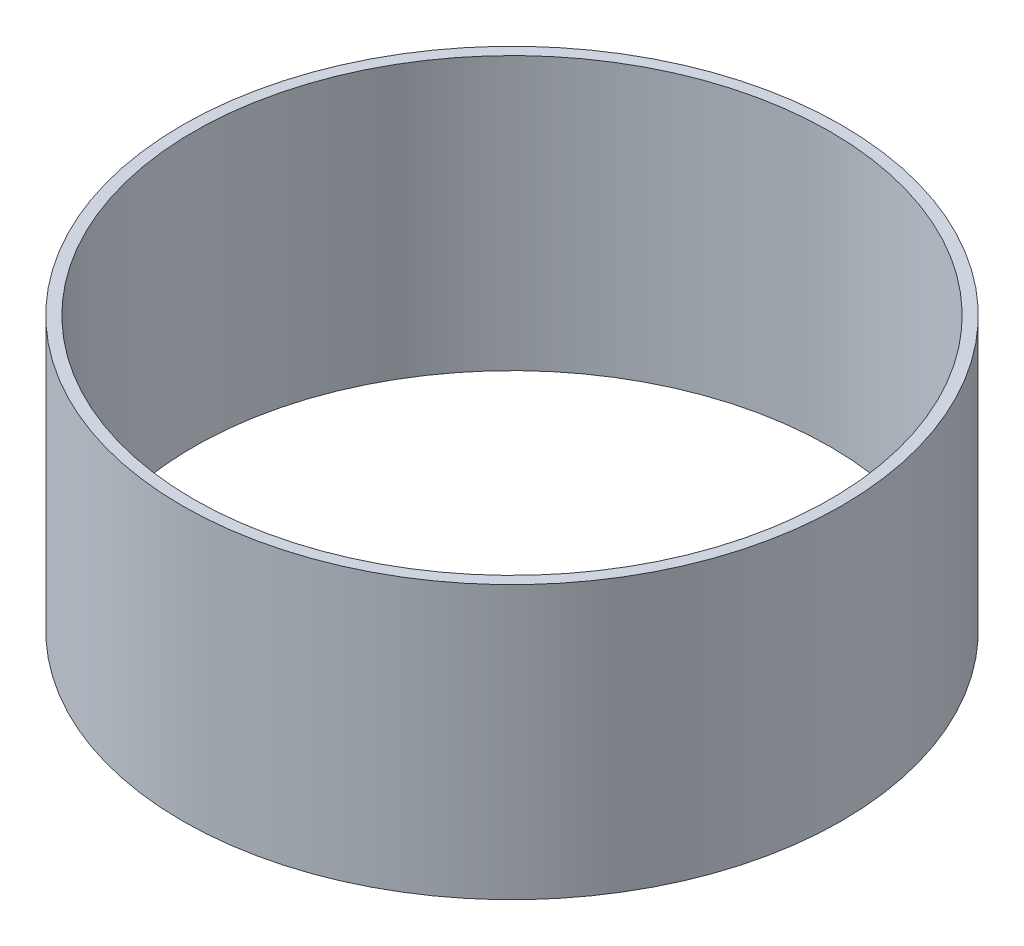
ISO-10303-21;
HEADER;
FILE_DESCRIPTION(('STEP AP214'),'2;1');
FILE_NAME('part.step','',(''),(''),'','','');
FILE_SCHEMA(('AUTOMOTIVE_DESIGN { 1 0 10303 214 1 1 1 1 }'));
ENDSEC;
DATA;
#1=APPLICATION_CONTEXT('core data for automotive mechanical design processes');
#2=APPLICATION_PROTOCOL_DEFINITION('international standard','automotive_design',2000,#1);
#3=PRODUCT_CONTEXT('',#1,'mechanical');
#4=PRODUCT('Part','Part','',(#3));
#5=PRODUCT_RELATED_PRODUCT_CATEGORY('part','',(#4));
#6=PRODUCT_DEFINITION_FORMATION('','',#4);
#7=PRODUCT_DEFINITION_CONTEXT('part definition',#1,'design');
#8=PRODUCT_DEFINITION('design','',#6,#7);
#9=PRODUCT_DEFINITION_SHAPE('','',#8);
#10=(LENGTH_UNIT() NAMED_UNIT(*) SI_UNIT(.MILLI.,.METRE.));
#11=(NAMED_UNIT(*) PLANE_ANGLE_UNIT() SI_UNIT($,.RADIAN.));
#12=(NAMED_UNIT(*) SI_UNIT($,.STERADIAN.) SOLID_ANGLE_UNIT());
#13=UNCERTAINTY_MEASURE_WITH_UNIT(LENGTH_MEASURE(1.E-05),#10,'distance_accuracy_value','');
#14=(GEOMETRIC_REPRESENTATION_CONTEXT(3) GLOBAL_UNCERTAINTY_ASSIGNED_CONTEXT((#13)) GLOBAL_UNIT_ASSIGNED_CONTEXT((#10,
#11,#12)) REPRESENTATION_CONTEXT('',''));
#15=CARTESIAN_POINT('',(0.,0.,0.));
#16=DIRECTION('',(0.,0.,1.));
#17=DIRECTION('',(1.,0.,0.));
#18=AXIS2_PLACEMENT_3D('',#15,#16,#17);
#19=CARTESIAN_POINT('',(0.,38.1,0.));
#20=DIRECTION('',(0.,1.,0.));
#21=DIRECTION('',(0.,0.,1.));
#22=AXIS2_PLACEMENT_3D('',#19,#20,#21);
#23=PLANE('',#22);
#24=CARTESIAN_POINT('',(0.,38.1,0.));
#25=DIRECTION('',(0.,1.,0.));
#26=DIRECTION('',(0.,0.,1.));
#27=AXIS2_PLACEMENT_3D('',#24,#25,#26);
#28=CIRCLE('',#27,92.075);
#29=CARTESIAN_POINT('',(0.,38.1,-92.075));
#30=VERTEX_POINT('',#29);
#31=EDGE_CURVE('E10',#30,#30,#28,.T.);
#32=ORIENTED_EDGE('',*,*,#31,.T.);
#33=EDGE_LOOP('',(#32));
#34=FACE_BOUND('',#33,.T.);
#35=CARTESIAN_POINT('',(0.,38.1,0.));
#36=DIRECTION('',(0.,1.,0.));
#37=DIRECTION('',(0.,0.,1.));
#38=AXIS2_PLACEMENT_3D('',#35,#36,#37);
#39=CIRCLE('',#38,88.9);
#40=CARTESIAN_POINT('',(0.,38.1,-88.9));
#41=VERTEX_POINT('',#40);
#42=EDGE_CURVE('E54',#41,#41,#39,.T.);
#43=ORIENTED_EDGE('',*,*,#42,.F.);
#44=EDGE_LOOP('',(#43));
#45=FACE_BOUND('',#44,.T.);
#46=ADVANCED_FACE('F43',(#34,#45),#23,.T.);
#47=CARTESIAN_POINT('',(0.,-38.1,0.));
#48=DIRECTION('',(0.,1.,0.));
#49=DIRECTION('',(0.,0.,1.));
#50=AXIS2_PLACEMENT_3D('',#47,#48,#49);
#51=PLANE('',#50);
#52=CARTESIAN_POINT('',(0.,-38.1,0.));
#53=DIRECTION('',(0.,1.,0.));
#54=DIRECTION('',(0.,0.,1.));
#55=AXIS2_PLACEMENT_3D('',#52,#53,#54);
#56=CIRCLE('',#55,92.075);
#57=CARTESIAN_POINT('',(0.,-38.1,-92.075));
#58=VERTEX_POINT('',#57);
#59=EDGE_CURVE('E47',#58,#58,#56,.T.);
#60=ORIENTED_EDGE('',*,*,#59,.F.);
#61=EDGE_LOOP('',(#60));
#62=FACE_BOUND('',#61,.T.);
#63=CARTESIAN_POINT('',(0.,-38.1,0.));
#64=DIRECTION('',(0.,1.,0.));
#65=DIRECTION('',(0.,0.,1.));
#66=AXIS2_PLACEMENT_3D('',#63,#64,#65);
#67=CIRCLE('',#66,88.9);
#68=CARTESIAN_POINT('',(0.,-38.1,-88.9));
#69=VERTEX_POINT('',#68);
#70=EDGE_CURVE('E56',#69,#69,#67,.T.);
#71=ORIENTED_EDGE('',*,*,#70,.T.);
#72=EDGE_LOOP('',(#71));
#73=FACE_BOUND('',#72,.T.);
#74=ADVANCED_FACE('F66',(#62,#73),#51,.F.);
#75=CARTESIAN_POINT('',(0.,38.1,0.));
#76=DIRECTION('',(0.,-1.,0.));
#77=DIRECTION('',(0.,0.,-1.));
#78=AXIS2_PLACEMENT_3D('',#75,#76,#77);
#79=CYLINDRICAL_SURFACE('',#78,92.075);
#80=CARTESIAN_POINT('',(0.,38.1,-92.075));
#81=CARTESIAN_POINT('',(0.,37.30625,-92.075));
#82=CARTESIAN_POINT('',(0.,36.5125,-92.075));
#83=CARTESIAN_POINT('',(0.,34.925,-92.075));
#84=CARTESIAN_POINT('',(0.,34.13125,-92.075));
#85=CARTESIAN_POINT('',(0.,32.54375,-92.075));
#86=CARTESIAN_POINT('',(0.,31.75,-92.075));
#87=CARTESIAN_POINT('',(0.,30.1625,-92.075));
#88=CARTESIAN_POINT('',(0.,29.36875,-92.075));
#89=CARTESIAN_POINT('',(0.,27.78125,-92.075));
#90=CARTESIAN_POINT('',(0.,26.9875,-92.075));
#91=CARTESIAN_POINT('',(0.,25.4,-92.075));
#92=CARTESIAN_POINT('',(0.,24.60625,-92.075));
#93=CARTESIAN_POINT('',(0.,23.01875,-92.075));
#94=CARTESIAN_POINT('',(0.,22.225,-92.075));
#95=CARTESIAN_POINT('',(0.,20.6375,-92.075));
#96=CARTESIAN_POINT('',(0.,19.84375,-92.075));
#97=CARTESIAN_POINT('',(0.,18.25625,-92.075));
#98=CARTESIAN_POINT('',(0.,17.4625,-92.075));
#99=CARTESIAN_POINT('',(0.,15.875,-92.075));
#100=CARTESIAN_POINT('',(0.,15.08125,-92.075));
#101=CARTESIAN_POINT('',(0.,13.49375,-92.075));
#102=CARTESIAN_POINT('',(0.,12.7,-92.075));
#103=CARTESIAN_POINT('',(0.,11.1125,-92.075));
#104=CARTESIAN_POINT('',(0.,10.31875,-92.075));
#105=CARTESIAN_POINT('',(0.,8.73124999999999,-92.075));
#106=CARTESIAN_POINT('',(0.,7.93749999999999,-92.075));
#107=CARTESIAN_POINT('',(0.,6.35,-92.075));
#108=CARTESIAN_POINT('',(0.,5.55625,-92.075));
#109=CARTESIAN_POINT('',(0.,3.96875,-92.075));
#110=CARTESIAN_POINT('',(0.,3.175,-92.075));
#111=CARTESIAN_POINT('',(0.,1.5875,-92.075));
#112=CARTESIAN_POINT('',(0.,0.793750000000001,-92.075));
#113=CARTESIAN_POINT('',(0.,-0.793750000000001,-92.075));
#114=CARTESIAN_POINT('',(0.,-1.5875,-92.075));
#115=CARTESIAN_POINT('',(0.,-3.175,-92.075));
#116=CARTESIAN_POINT('',(0.,-3.96875,-92.075));
#117=CARTESIAN_POINT('',(0.,-5.55625,-92.075));
#118=CARTESIAN_POINT('',(0.,-6.35,-92.075));
#119=CARTESIAN_POINT('',(0.,-7.93750000000001,-92.075));
#120=CARTESIAN_POINT('',(0.,-8.73125,-92.075));
#121=CARTESIAN_POINT('',(0.,-10.31875,-92.075));
#122=CARTESIAN_POINT('',(0.,-11.1125,-92.075));
#123=CARTESIAN_POINT('',(0.,-12.7,-92.075));
#124=CARTESIAN_POINT('',(0.,-13.49375,-92.075));
#125=CARTESIAN_POINT('',(0.,-15.08125,-92.075));
#126=CARTESIAN_POINT('',(0.,-15.875,-92.075));
#127=CARTESIAN_POINT('',(0.,-17.4625,-92.075));
#128=CARTESIAN_POINT('',(0.,-18.25625,-92.075));
#129=CARTESIAN_POINT('',(0.,-19.84375,-92.075));
#130=CARTESIAN_POINT('',(0.,-20.6375,-92.075));
#131=CARTESIAN_POINT('',(0.,-22.225,-92.075));
#132=CARTESIAN_POINT('',(0.,-23.01875,-92.075));
#133=CARTESIAN_POINT('',(0.,-24.60625,-92.075));
#134=CARTESIAN_POINT('',(0.,-25.4,-92.075));
#135=CARTESIAN_POINT('',(0.,-26.9875,-92.075));
#136=CARTESIAN_POINT('',(0.,-27.78125,-92.075));
#137=CARTESIAN_POINT('',(0.,-29.36875,-92.075));
#138=CARTESIAN_POINT('',(0.,-30.1625,-92.075));
#139=CARTESIAN_POINT('',(0.,-31.75,-92.075));
#140=CARTESIAN_POINT('',(0.,-32.54375,-92.075));
#141=CARTESIAN_POINT('',(0.,-34.13125,-92.075));
#142=CARTESIAN_POINT('',(0.,-34.925,-92.075));
#143=CARTESIAN_POINT('',(0.,-36.5125,-92.075));
#144=CARTESIAN_POINT('',(0.,-37.30625,-92.075));
#145=CARTESIAN_POINT('',(0.,-38.1,-92.075));
#146=B_SPLINE_CURVE_WITH_KNOTS('',3,(#80,#81,#82,#83,#84,#85,#86,#87,#88,#89,#90,#91,#92,#93,
#94,#95,#96,#97,#98,#99,#100,#101,#102,#103,#104,#105,#106,#107,#108,#109,#110,#111,#112,#113,
#114,#115,#116,#117,#118,#119,#120,#121,#122,#123,#124,#125,#126,#127,#128,#129,#130,#131,#132,
#133,#134,#135,#136,#137,#138,#139,#140,#141,#142,#143,#144,#145),.UNSPECIFIED.,.F.,.F.,(4,2,2,
2,2,2,2,2,2,2,2,2,2,2,2,2,2,2,2,2,2,2,2,2,2,2,2,2,2,2,2,2,4),(0.,2.38125,4.7625,7.14375,
9.52500000000001,11.90625,14.2875,16.66875,19.05,21.43125,23.8125,26.19375,28.575,30.95625,
33.3375,35.71875,38.1,40.48125,42.8625,45.24375,47.625,50.00625,52.3875,54.76875,57.15,59.53125,
61.9125,64.29375,66.675,69.05625,71.4375,73.81875,76.2),.UNSPECIFIED.);
#147=EDGE_CURVE('BSEAM45',#30,#58,#146,.T.);
#148=ORIENTED_EDGE('',*,*,#31,.F.);
#149=ORIENTED_EDGE('',*,*,#59,.T.);
#150=ORIENTED_EDGE('',*,*,#147,.T.);
#151=ORIENTED_EDGE('',*,*,#147,.F.);
#152=EDGE_LOOP('',(#148,#150,#149,#151));
#153=FACE_BOUND('',#152,.T.);
#154=ADVANCED_FACE('F45',(#153),#79,.T.);
#155=CARTESIAN_POINT('',(0.,38.1,0.));
#156=DIRECTION('',(0.,-1.,0.));
#157=DIRECTION('',(0.,0.,-1.));
#158=AXIS2_PLACEMENT_3D('',#155,#156,#157);
#159=CYLINDRICAL_SURFACE('',#158,88.9);
#160=CARTESIAN_POINT('',(0.,38.1,-88.9));
#161=CARTESIAN_POINT('',(0.,37.30625,-88.9));
#162=CARTESIAN_POINT('',(0.,36.5125,-88.9));
#163=CARTESIAN_POINT('',(0.,34.925,-88.9));
#164=CARTESIAN_POINT('',(0.,34.13125,-88.9));
#165=CARTESIAN_POINT('',(0.,32.54375,-88.9));
#166=CARTESIAN_POINT('',(0.,31.75,-88.9));
#167=CARTESIAN_POINT('',(0.,30.1625,-88.9));
#168=CARTESIAN_POINT('',(0.,29.36875,-88.9));
#169=CARTESIAN_POINT('',(0.,27.78125,-88.9));
#170=CARTESIAN_POINT('',(0.,26.9875,-88.9));
#171=CARTESIAN_POINT('',(0.,25.4,-88.9));
#172=CARTESIAN_POINT('',(0.,24.60625,-88.9));
#173=CARTESIAN_POINT('',(0.,23.01875,-88.9));
#174=CARTESIAN_POINT('',(0.,22.225,-88.9));
#175=CARTESIAN_POINT('',(0.,20.6375,-88.9));
#176=CARTESIAN_POINT('',(0.,19.84375,-88.9));
#177=CARTESIAN_POINT('',(0.,18.25625,-88.9));
#178=CARTESIAN_POINT('',(0.,17.4625,-88.9));
#179=CARTESIAN_POINT('',(0.,15.875,-88.9));
#180=CARTESIAN_POINT('',(0.,15.08125,-88.9));
#181=CARTESIAN_POINT('',(0.,13.49375,-88.9));
#182=CARTESIAN_POINT('',(0.,12.7,-88.9));
#183=CARTESIAN_POINT('',(0.,11.1125,-88.9));
#184=CARTESIAN_POINT('',(0.,10.31875,-88.9));
#185=CARTESIAN_POINT('',(0.,8.73124999999999,-88.9));
#186=CARTESIAN_POINT('',(0.,7.93749999999999,-88.9));
#187=CARTESIAN_POINT('',(0.,6.34999999999999,-88.9));
#188=CARTESIAN_POINT('',(0.,5.55625,-88.9));
#189=CARTESIAN_POINT('',(0.,3.96875,-88.9));
#190=CARTESIAN_POINT('',(0.,3.17499999999999,-88.9));
#191=CARTESIAN_POINT('',(0.,1.58749999999999,-88.9));
#192=CARTESIAN_POINT('',(0.,0.793749999999994,-88.9));
#193=CARTESIAN_POINT('',(0.,-0.793750000000007,-88.9));
#194=CARTESIAN_POINT('',(0.,-1.58750000000001,-88.9));
#195=CARTESIAN_POINT('',(0.,-3.17500000000001,-88.9));
#196=CARTESIAN_POINT('',(0.,-3.96875000000001,-88.9));
#197=CARTESIAN_POINT('',(0.,-5.55625000000001,-88.9));
#198=CARTESIAN_POINT('',(0.,-6.35000000000001,-88.9));
#199=CARTESIAN_POINT('',(0.,-7.93750000000001,-88.9));
#200=CARTESIAN_POINT('',(0.,-8.73125000000001,-88.9));
#201=CARTESIAN_POINT('',(0.,-10.31875,-88.9));
#202=CARTESIAN_POINT('',(0.,-11.1125,-88.9));
#203=CARTESIAN_POINT('',(0.,-12.7,-88.9));
#204=CARTESIAN_POINT('',(0.,-13.49375,-88.9));
#205=CARTESIAN_POINT('',(0.,-15.08125,-88.9));
#206=CARTESIAN_POINT('',(0.,-15.875,-88.9));
#207=CARTESIAN_POINT('',(0.,-17.4625,-88.9));
#208=CARTESIAN_POINT('',(0.,-18.25625,-88.9));
#209=CARTESIAN_POINT('',(0.,-19.84375,-88.9));
#210=CARTESIAN_POINT('',(0.,-20.6375,-88.9));
#211=CARTESIAN_POINT('',(0.,-22.225,-88.9));
#212=CARTESIAN_POINT('',(0.,-23.01875,-88.9));
#213=CARTESIAN_POINT('',(0.,-24.60625,-88.9));
#214=CARTESIAN_POINT('',(0.,-25.4,-88.9));
#215=CARTESIAN_POINT('',(0.,-26.9875,-88.9));
#216=CARTESIAN_POINT('',(0.,-27.78125,-88.9));
#217=CARTESIAN_POINT('',(0.,-29.36875,-88.9));
#218=CARTESIAN_POINT('',(0.,-30.1625,-88.9));
#219=CARTESIAN_POINT('',(0.,-31.75,-88.9));
#220=CARTESIAN_POINT('',(0.,-32.54375,-88.9));
#221=CARTESIAN_POINT('',(0.,-34.13125,-88.9));
#222=CARTESIAN_POINT('',(0.,-34.925,-88.9));
#223=CARTESIAN_POINT('',(0.,-36.5125,-88.9));
#224=CARTESIAN_POINT('',(0.,-37.30625,-88.9));
#225=CARTESIAN_POINT('',(0.,-38.1,-88.9));
#226=B_SPLINE_CURVE_WITH_KNOTS('',3,(#160,#161,#162,#163,#164,#165,#166,#167,#168,#169,#170,
#171,#172,#173,#174,#175,#176,#177,#178,#179,#180,#181,#182,#183,#184,#185,#186,#187,#188,#189,
#190,#191,#192,#193,#194,#195,#196,#197,#198,#199,#200,#201,#202,#203,#204,#205,#206,#207,#208,
#209,#210,#211,#212,#213,#214,#215,#216,#217,#218,#219,#220,#221,#222,#223,#224,#225),
.UNSPECIFIED.,.F.,.F.,(4,2,2,2,2,2,2,2,2,2,2,2,2,2,2,2,2,2,2,2,2,2,2,2,2,2,2,2,2,2,2,2,4),(0.,
2.38124999999999,4.7625,7.14375,9.525,11.90625,14.2875,16.66875,19.05,21.43125,23.8125,26.19375,
28.575,30.95625,33.3375,35.71875,38.1,40.48125,42.8625,45.24375,47.625,50.00625,52.3875,
54.76875,57.15,59.53125,61.9125,64.29375,66.675,69.05625,71.4375,73.81875,76.2),.UNSPECIFIED.);
#227=EDGE_CURVE('BSEAM62',#41,#69,#226,.T.);
#228=ORIENTED_EDGE('',*,*,#42,.T.);
#229=ORIENTED_EDGE('',*,*,#70,.F.);
#230=ORIENTED_EDGE('',*,*,#227,.T.);
#231=ORIENTED_EDGE('',*,*,#227,.F.);
#232=EDGE_LOOP('',(#228,#230,#229,#231));
#233=FACE_BOUND('',#232,.T.);
#234=ADVANCED_FACE('F62',(#233),#159,.F.);
#235=CLOSED_SHELL('',(#46,#74,#154,#234));
#236=MANIFOLD_SOLID_BREP('B2',#235);
#237=ADVANCED_BREP_SHAPE_REPRESENTATION('',(#18,#236),#14);
#238=SHAPE_DEFINITION_REPRESENTATION(#9,#237);
ENDSEC;
END-ISO-10303-21;
